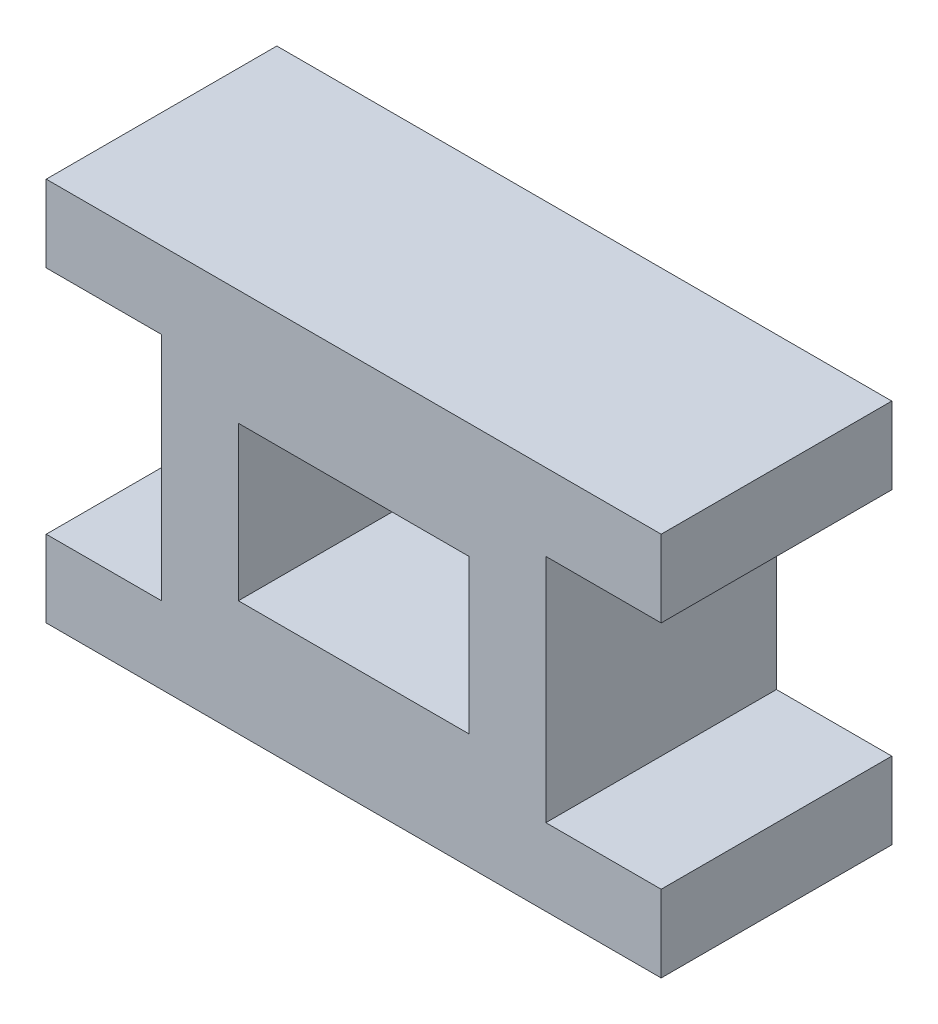
ISO-10303-21;
HEADER;
FILE_DESCRIPTION(('STEP AP214'),'2;1');
FILE_NAME('part.step','',(''),(''),'','','');
FILE_SCHEMA(('AUTOMOTIVE_DESIGN { 1 0 10303 214 1 1 1 1 }'));
ENDSEC;
DATA;
#1=APPLICATION_CONTEXT('core data for automotive mechanical design processes');
#2=APPLICATION_PROTOCOL_DEFINITION('international standard','automotive_design',2000,#1);
#3=PRODUCT_CONTEXT('',#1,'mechanical');
#4=PRODUCT('Part','Part','',(#3));
#5=PRODUCT_RELATED_PRODUCT_CATEGORY('part','',(#4));
#6=PRODUCT_DEFINITION_FORMATION('','',#4);
#7=PRODUCT_DEFINITION_CONTEXT('part definition',#1,'design');
#8=PRODUCT_DEFINITION('design','',#6,#7);
#9=PRODUCT_DEFINITION_SHAPE('','',#8);
#10=(LENGTH_UNIT() NAMED_UNIT(*) SI_UNIT(.MILLI.,.METRE.));
#11=(NAMED_UNIT(*) PLANE_ANGLE_UNIT() SI_UNIT($,.RADIAN.));
#12=(NAMED_UNIT(*) SI_UNIT($,.STERADIAN.) SOLID_ANGLE_UNIT());
#13=UNCERTAINTY_MEASURE_WITH_UNIT(LENGTH_MEASURE(1.E-05),#10,'distance_accuracy_value','');
#14=(GEOMETRIC_REPRESENTATION_CONTEXT(3) GLOBAL_UNCERTAINTY_ASSIGNED_CONTEXT((#13)) GLOBAL_UNIT_ASSIGNED_CONTEXT((#10,
#11,#12)) REPRESENTATION_CONTEXT('',''));
#15=CARTESIAN_POINT('',(0.,0.,0.));
#16=DIRECTION('',(0.,0.,1.));
#17=DIRECTION('',(1.,0.,0.));
#18=AXIS2_PLACEMENT_3D('',#15,#16,#17);
#19=CARTESIAN_POINT('',(0.,35.,30.));
#20=DIRECTION('',(0.,1.,0.));
#21=DIRECTION('',(0.,0.,1.));
#22=AXIS2_PLACEMENT_3D('',#19,#20,#21);
#23=PLANE('',#22);
#24=DIRECTION('',(1.,0.,0.));
#25=VECTOR('',#24,1.);
#26=CARTESIAN_POINT('',(0.,35.,0.));
#27=LINE('',#26,#25);
#28=CARTESIAN_POINT('',(-15.,35.,0.));
#29=VERTEX_POINT('',#28);
#30=CARTESIAN_POINT('',(15.,35.,0.));
#31=VERTEX_POINT('',#30);
#32=EDGE_CURVE('E216',#29,#31,#27,.T.);
#33=ORIENTED_EDGE('',*,*,#32,.T.);
#34=DIRECTION('',(0.,0.,-1.));
#35=VECTOR('',#34,1.);
#36=CARTESIAN_POINT('',(15.,35.,30.));
#37=LINE('',#36,#35);
#38=CARTESIAN_POINT('',(15.,35.,30.));
#39=VERTEX_POINT('',#38);
#40=EDGE_CURVE('E11',#39,#31,#37,.T.);
#41=ORIENTED_EDGE('',*,*,#40,.F.);
#42=DIRECTION('',(1.,0.,0.));
#43=VECTOR('',#42,1.);
#44=CARTESIAN_POINT('',(0.,35.,30.));
#45=LINE('',#44,#43);
#46=CARTESIAN_POINT('',(-15.,35.,30.));
#47=VERTEX_POINT('',#46);
#48=EDGE_CURVE('E165',#47,#39,#45,.T.);
#49=ORIENTED_EDGE('',*,*,#48,.F.);
#50=DIRECTION('',(0.,0.,-1.));
#51=VECTOR('',#50,1.);
#52=CARTESIAN_POINT('',(-15.,35.,30.));
#53=LINE('',#52,#51);
#54=EDGE_CURVE('E56',#47,#29,#53,.T.);
#55=ORIENTED_EDGE('',*,*,#54,.T.);
#56=EDGE_LOOP('',(#33,#41,#49,#55));
#57=FACE_BOUND('',#56,.T.);
#58=ADVANCED_FACE('F37',(#57),#23,.F.);
#59=CARTESIAN_POINT('',(15.,0.,30.));
#60=DIRECTION('',(1.,0.,0.));
#61=DIRECTION('',(0.,0.,-1.));
#62=AXIS2_PLACEMENT_3D('',#59,#60,#61);
#63=PLANE('',#62);
#64=DIRECTION('',(0.,-1.,0.));
#65=VECTOR('',#64,1.);
#66=CARTESIAN_POINT('',(15.,0.,0.));
#67=LINE('',#66,#65);
#68=CARTESIAN_POINT('',(15.,15.,0.));
#69=VERTEX_POINT('',#68);
#70=EDGE_CURVE('E171',#31,#69,#67,.T.);
#71=ORIENTED_EDGE('',*,*,#70,.T.);
#72=DIRECTION('',(0.,0.,-1.));
#73=VECTOR('',#72,1.);
#74=CARTESIAN_POINT('',(15.,15.,30.));
#75=LINE('',#74,#73);
#76=CARTESIAN_POINT('',(15.,15.,30.));
#77=VERTEX_POINT('',#76);
#78=EDGE_CURVE('E47',#77,#69,#75,.T.);
#79=ORIENTED_EDGE('',*,*,#78,.F.);
#80=DIRECTION('',(0.,-1.,0.));
#81=VECTOR('',#80,1.);
#82=CARTESIAN_POINT('',(15.,0.,30.));
#83=LINE('',#82,#81);
#84=EDGE_CURVE('E159',#39,#77,#83,.T.);
#85=ORIENTED_EDGE('',*,*,#84,.F.);
#86=ORIENTED_EDGE('',*,*,#40,.T.);
#87=EDGE_LOOP('',(#71,#79,#85,#86));
#88=FACE_BOUND('',#87,.T.);
#89=ADVANCED_FACE('F170',(#88),#63,.F.);
#90=CARTESIAN_POINT('',(0.,15.,30.));
#91=DIRECTION('',(0.,1.,0.));
#92=DIRECTION('',(0.,0.,1.));
#93=AXIS2_PLACEMENT_3D('',#90,#91,#92);
#94=PLANE('',#93);
#95=DIRECTION('',(1.,0.,0.));
#96=VECTOR('',#95,1.);
#97=CARTESIAN_POINT('',(0.,15.,0.));
#98=LINE('',#97,#96);
#99=CARTESIAN_POINT('',(-15.,15.,0.));
#100=VERTEX_POINT('',#99);
#101=EDGE_CURVE('E219',#100,#69,#98,.T.);
#102=ORIENTED_EDGE('',*,*,#101,.F.);
#103=DIRECTION('',(0.,0.,-1.));
#104=VECTOR('',#103,1.);
#105=CARTESIAN_POINT('',(-15.,15.,30.));
#106=LINE('',#105,#104);
#107=CARTESIAN_POINT('',(-15.,15.,30.));
#108=VERTEX_POINT('',#107);
#109=EDGE_CURVE('E106',#108,#100,#106,.T.);
#110=ORIENTED_EDGE('',*,*,#109,.F.);
#111=DIRECTION('',(1.,0.,0.));
#112=VECTOR('',#111,1.);
#113=CARTESIAN_POINT('',(0.,15.,30.));
#114=LINE('',#113,#112);
#115=EDGE_CURVE('E164',#108,#77,#114,.T.);
#116=ORIENTED_EDGE('',*,*,#115,.T.);
#117=ORIENTED_EDGE('',*,*,#78,.T.);
#118=EDGE_LOOP('',(#102,#110,#116,#117));
#119=FACE_BOUND('',#118,.T.);
#120=ADVANCED_FACE('F175',(#119),#94,.T.);
#121=CARTESIAN_POINT('',(0.,40.,30.));
#122=DIRECTION('',(0.,1.,0.));
#123=DIRECTION('',(0.,0.,1.));
#124=AXIS2_PLACEMENT_3D('',#121,#122,#123);
#125=PLANE('',#124);
#126=DIRECTION('',(1.,0.,0.));
#127=VECTOR('',#126,1.);
#128=CARTESIAN_POINT('',(0.,40.,0.));
#129=LINE('',#128,#127);
#130=CARTESIAN_POINT('',(-40.,40.,0.));
#131=VERTEX_POINT('',#130);
#132=CARTESIAN_POINT('',(-25.,40.,0.));
#133=VERTEX_POINT('',#132);
#134=EDGE_CURVE('E182',#131,#133,#129,.T.);
#135=ORIENTED_EDGE('',*,*,#134,.T.);
#136=DIRECTION('',(0.,0.,-1.));
#137=VECTOR('',#136,1.);
#138=CARTESIAN_POINT('',(-25.,40.,30.));
#139=LINE('',#138,#137);
#140=CARTESIAN_POINT('',(-25.,40.,30.));
#141=VERTEX_POINT('',#140);
#142=EDGE_CURVE('E41',#141,#133,#139,.T.);
#143=ORIENTED_EDGE('',*,*,#142,.F.);
#144=DIRECTION('',(1.,0.,0.));
#145=VECTOR('',#144,1.);
#146=CARTESIAN_POINT('',(0.,40.,30.));
#147=LINE('',#146,#145);
#148=CARTESIAN_POINT('',(-40.,40.,30.));
#149=VERTEX_POINT('',#148);
#150=EDGE_CURVE('E224',#149,#141,#147,.T.);
#151=ORIENTED_EDGE('',*,*,#150,.F.);
#152=DIRECTION('',(0.,0.,-1.));
#153=VECTOR('',#152,1.);
#154=CARTESIAN_POINT('',(-40.,40.,30.));
#155=LINE('',#154,#153);
#156=EDGE_CURVE('E178',#149,#131,#155,.T.);
#157=ORIENTED_EDGE('',*,*,#156,.T.);
#158=EDGE_LOOP('',(#135,#143,#151,#157));
#159=FACE_BOUND('',#158,.T.);
#160=ADVANCED_FACE('F39',(#159),#125,.F.);
#161=CARTESIAN_POINT('',(-25.,0.,30.));
#162=DIRECTION('',(1.,0.,0.));
#163=DIRECTION('',(0.,0.,-1.));
#164=AXIS2_PLACEMENT_3D('',#161,#162,#163);
#165=PLANE('',#164);
#166=DIRECTION('',(0.,-1.,0.));
#167=VECTOR('',#166,1.);
#168=CARTESIAN_POINT('',(-25.,0.,0.));
#169=LINE('',#168,#167);
#170=CARTESIAN_POINT('',(-25.,10.,0.));
#171=VERTEX_POINT('',#170);
#172=EDGE_CURVE('E185',#133,#171,#169,.T.);
#173=ORIENTED_EDGE('',*,*,#172,.T.);
#174=DIRECTION('',(0.,0.,-1.));
#175=VECTOR('',#174,1.);
#176=CARTESIAN_POINT('',(-25.,10.,30.));
#177=LINE('',#176,#175);
#178=CARTESIAN_POINT('',(-25.,10.,30.));
#179=VERTEX_POINT('',#178);
#180=EDGE_CURVE('E247',#179,#171,#177,.T.);
#181=ORIENTED_EDGE('',*,*,#180,.F.);
#182=DIRECTION('',(0.,-1.,0.));
#183=VECTOR('',#182,1.);
#184=CARTESIAN_POINT('',(-25.,0.,30.));
#185=LINE('',#184,#183);
#186=EDGE_CURVE('E119',#141,#179,#185,.T.);
#187=ORIENTED_EDGE('',*,*,#186,.F.);
#188=ORIENTED_EDGE('',*,*,#142,.T.);
#189=EDGE_LOOP('',(#173,#181,#187,#188));
#190=FACE_BOUND('',#189,.T.);
#191=ADVANCED_FACE('F252',(#190),#165,.F.);
#192=CARTESIAN_POINT('',(0.,9.99999999999999,30.));
#193=DIRECTION('',(0.,1.,0.));
#194=DIRECTION('',(-1.,0.,0.));
#195=AXIS2_PLACEMENT_3D('',#192,#193,#194);
#196=PLANE('',#195);
#197=DIRECTION('',(1.,0.,0.));
#198=VECTOR('',#197,1.);
#199=CARTESIAN_POINT('',(0.,9.99999999999999,0.));
#200=LINE('',#199,#198);
#201=CARTESIAN_POINT('',(-40.,10.,0.));
#202=VERTEX_POINT('',#201);
#203=EDGE_CURVE('E188',#202,#171,#200,.T.);
#204=ORIENTED_EDGE('',*,*,#203,.F.);
#205=DIRECTION('',(0.,0.,-1.));
#206=VECTOR('',#205,1.);
#207=CARTESIAN_POINT('',(-40.,10.,30.));
#208=LINE('',#207,#206);
#209=CARTESIAN_POINT('',(-40.,10.,30.));
#210=VERTEX_POINT('',#209);
#211=EDGE_CURVE('E246',#210,#202,#208,.T.);
#212=ORIENTED_EDGE('',*,*,#211,.F.);
#213=DIRECTION('',(1.,0.,0.));
#214=VECTOR('',#213,1.);
#215=CARTESIAN_POINT('',(0.,9.99999999999999,30.));
#216=LINE('',#215,#214);
#217=EDGE_CURVE('E267',#210,#179,#216,.T.);
#218=ORIENTED_EDGE('',*,*,#217,.T.);
#219=ORIENTED_EDGE('',*,*,#180,.T.);
#220=EDGE_LOOP('',(#204,#212,#218,#219));
#221=FACE_BOUND('',#220,.T.);
#222=ADVANCED_FACE('F264',(#221),#196,.T.);
#223=CARTESIAN_POINT('',(-40.,0.,30.));
#224=DIRECTION('',(1.,0.,0.));
#225=DIRECTION('',(0.,1.,0.));
#226=AXIS2_PLACEMENT_3D('',#223,#224,#225);
#227=PLANE('',#226);
#228=DIRECTION('',(0.,-1.,0.));
#229=VECTOR('',#228,1.);
#230=CARTESIAN_POINT('',(-40.,0.,0.));
#231=LINE('',#230,#229);
#232=CARTESIAN_POINT('',(-40.,0.,0.));
#233=VERTEX_POINT('',#232);
#234=EDGE_CURVE('E191',#202,#233,#231,.T.);
#235=ORIENTED_EDGE('',*,*,#234,.T.);
#236=DIRECTION('',(0.,0.,-1.));
#237=VECTOR('',#236,1.);
#238=CARTESIAN_POINT('',(-40.,0.,30.));
#239=LINE('',#238,#237);
#240=CARTESIAN_POINT('',(-40.,0.,30.));
#241=VERTEX_POINT('',#240);
#242=EDGE_CURVE('E243',#241,#233,#239,.T.);
#243=ORIENTED_EDGE('',*,*,#242,.F.);
#244=DIRECTION('',(0.,-1.,0.));
#245=VECTOR('',#244,1.);
#246=CARTESIAN_POINT('',(-40.,0.,30.));
#247=LINE('',#246,#245);
#248=EDGE_CURVE('E270',#210,#241,#247,.T.);
#249=ORIENTED_EDGE('',*,*,#248,.F.);
#250=ORIENTED_EDGE('',*,*,#211,.T.);
#251=EDGE_LOOP('',(#235,#243,#249,#250));
#252=FACE_BOUND('',#251,.T.);
#253=ADVANCED_FACE('F271',(#252),#227,.F.);
#254=CARTESIAN_POINT('',(0.,0.,30.));
#255=DIRECTION('',(0.,1.,0.));
#256=DIRECTION('',(0.,0.,1.));
#257=AXIS2_PLACEMENT_3D('',#254,#255,#256);
#258=PLANE('',#257);
#259=DIRECTION('',(1.,0.,0.));
#260=VECTOR('',#259,1.);
#261=CARTESIAN_POINT('',(0.,0.,0.));
#262=LINE('',#261,#260);
#263=CARTESIAN_POINT('',(40.,0.,0.));
#264=VERTEX_POINT('',#263);
#265=EDGE_CURVE('E193',#233,#264,#262,.T.);
#266=ORIENTED_EDGE('',*,*,#265,.T.);
#267=DIRECTION('',(0.,0.,-1.));
#268=VECTOR('',#267,1.);
#269=CARTESIAN_POINT('',(40.,0.,30.));
#270=LINE('',#269,#268);
#271=CARTESIAN_POINT('',(40.,0.,30.));
#272=VERTEX_POINT('',#271);
#273=EDGE_CURVE('E241',#272,#264,#270,.T.);
#274=ORIENTED_EDGE('',*,*,#273,.F.);
#275=DIRECTION('',(1.,0.,0.));
#276=VECTOR('',#275,1.);
#277=CARTESIAN_POINT('',(0.,0.,30.));
#278=LINE('',#277,#276);
#279=EDGE_CURVE('E274',#241,#272,#278,.T.);
#280=ORIENTED_EDGE('',*,*,#279,.F.);
#281=ORIENTED_EDGE('',*,*,#242,.T.);
#282=EDGE_LOOP('',(#266,#274,#280,#281));
#283=FACE_BOUND('',#282,.T.);
#284=ADVANCED_FACE('F327',(#283),#258,.F.);
#285=CARTESIAN_POINT('',(40.,0.,30.));
#286=DIRECTION('',(1.,0.,0.));
#287=DIRECTION('',(0.,1.,0.));
#288=AXIS2_PLACEMENT_3D('',#285,#286,#287);
#289=PLANE('',#288);
#290=DIRECTION('',(0.,-1.,0.));
#291=VECTOR('',#290,1.);
#292=CARTESIAN_POINT('',(40.,0.,0.));
#293=LINE('',#292,#291);
#294=CARTESIAN_POINT('',(40.,10.,0.));
#295=VERTEX_POINT('',#294);
#296=EDGE_CURVE('E196',#295,#264,#293,.T.);
#297=ORIENTED_EDGE('',*,*,#296,.F.);
#298=DIRECTION('',(0.,0.,-1.));
#299=VECTOR('',#298,1.);
#300=CARTESIAN_POINT('',(40.,10.,30.));
#301=LINE('',#300,#299);
#302=CARTESIAN_POINT('',(40.,10.,30.));
#303=VERTEX_POINT('',#302);
#304=EDGE_CURVE('E239',#303,#295,#301,.T.);
#305=ORIENTED_EDGE('',*,*,#304,.F.);
#306=DIRECTION('',(0.,-1.,0.));
#307=VECTOR('',#306,1.);
#308=CARTESIAN_POINT('',(40.,0.,30.));
#309=LINE('',#308,#307);
#310=EDGE_CURVE('E281',#303,#272,#309,.T.);
#311=ORIENTED_EDGE('',*,*,#310,.T.);
#312=ORIENTED_EDGE('',*,*,#273,.T.);
#313=EDGE_LOOP('',(#297,#305,#311,#312));
#314=FACE_BOUND('',#313,.T.);
#315=ADVANCED_FACE('F322',(#314),#289,.T.);
#316=CARTESIAN_POINT('',(0.,9.99999999999999,30.));
#317=DIRECTION('',(0.,-1.,0.));
#318=DIRECTION('',(1.,0.,0.));
#319=AXIS2_PLACEMENT_3D('',#316,#317,#318);
#320=PLANE('',#319);
#321=DIRECTION('',(-1.,0.,0.));
#322=VECTOR('',#321,1.);
#323=CARTESIAN_POINT('',(0.,9.99999999999999,0.));
#324=LINE('',#323,#322);
#325=CARTESIAN_POINT('',(25.,10.,0.));
#326=VERTEX_POINT('',#325);
#327=EDGE_CURVE('E199',#295,#326,#324,.T.);
#328=ORIENTED_EDGE('',*,*,#327,.T.);
#329=DIRECTION('',(0.,0.,-1.));
#330=VECTOR('',#329,1.);
#331=CARTESIAN_POINT('',(25.,10.,30.));
#332=LINE('',#331,#330);
#333=CARTESIAN_POINT('',(25.,10.,30.));
#334=VERTEX_POINT('',#333);
#335=EDGE_CURVE('E237',#334,#326,#332,.T.);
#336=ORIENTED_EDGE('',*,*,#335,.F.);
#337=DIRECTION('',(-1.,0.,0.));
#338=VECTOR('',#337,1.);
#339=CARTESIAN_POINT('',(0.,9.99999999999999,30.));
#340=LINE('',#339,#338);
#341=EDGE_CURVE('E284',#303,#334,#340,.T.);
#342=ORIENTED_EDGE('',*,*,#341,.F.);
#343=ORIENTED_EDGE('',*,*,#304,.T.);
#344=EDGE_LOOP('',(#328,#336,#342,#343));
#345=FACE_BOUND('',#344,.T.);
#346=ADVANCED_FACE('F328',(#345),#320,.F.);
#347=CARTESIAN_POINT('',(25.,0.,30.));
#348=DIRECTION('',(1.,0.,0.));
#349=DIRECTION('',(0.,0.,-1.));
#350=AXIS2_PLACEMENT_3D('',#347,#348,#349);
#351=PLANE('',#350);
#352=DIRECTION('',(0.,-1.,0.));
#353=VECTOR('',#352,1.);
#354=CARTESIAN_POINT('',(25.,0.,0.));
#355=LINE('',#354,#353);
#356=CARTESIAN_POINT('',(25.,40.,0.));
#357=VERTEX_POINT('',#356);
#358=EDGE_CURVE('E202',#357,#326,#355,.T.);
#359=ORIENTED_EDGE('',*,*,#358,.F.);
#360=DIRECTION('',(0.,0.,-1.));
#361=VECTOR('',#360,1.);
#362=CARTESIAN_POINT('',(25.,40.,30.));
#363=LINE('',#362,#361);
#364=CARTESIAN_POINT('',(25.,40.,30.));
#365=VERTEX_POINT('',#364);
#366=EDGE_CURVE('E235',#365,#357,#363,.T.);
#367=ORIENTED_EDGE('',*,*,#366,.F.);
#368=DIRECTION('',(0.,-1.,0.));
#369=VECTOR('',#368,1.);
#370=CARTESIAN_POINT('',(25.,0.,30.));
#371=LINE('',#370,#369);
#372=EDGE_CURVE('E286',#365,#334,#371,.T.);
#373=ORIENTED_EDGE('',*,*,#372,.T.);
#374=ORIENTED_EDGE('',*,*,#335,.T.);
#375=EDGE_LOOP('',(#359,#367,#373,#374));
#376=FACE_BOUND('',#375,.T.);
#377=ADVANCED_FACE('F316',(#376),#351,.T.);
#378=CARTESIAN_POINT('',(0.,40.,30.));
#379=DIRECTION('',(0.,-1.,0.));
#380=DIRECTION('',(0.,0.,-1.));
#381=AXIS2_PLACEMENT_3D('',#378,#379,#380);
#382=PLANE('',#381);
#383=DIRECTION('',(-1.,0.,0.));
#384=VECTOR('',#383,1.);
#385=CARTESIAN_POINT('',(0.,40.,0.));
#386=LINE('',#385,#384);
#387=CARTESIAN_POINT('',(40.,40.,0.));
#388=VERTEX_POINT('',#387);
#389=EDGE_CURVE('E205',#388,#357,#386,.T.);
#390=ORIENTED_EDGE('',*,*,#389,.F.);
#391=DIRECTION('',(0.,0.,-1.));
#392=VECTOR('',#391,1.);
#393=CARTESIAN_POINT('',(40.,40.,30.));
#394=LINE('',#393,#392);
#395=CARTESIAN_POINT('',(40.,40.,30.));
#396=VERTEX_POINT('',#395);
#397=EDGE_CURVE('E233',#396,#388,#394,.T.);
#398=ORIENTED_EDGE('',*,*,#397,.F.);
#399=DIRECTION('',(-1.,0.,0.));
#400=VECTOR('',#399,1.);
#401=CARTESIAN_POINT('',(0.,40.,30.));
#402=LINE('',#401,#400);
#403=EDGE_CURVE('E289',#396,#365,#402,.T.);
#404=ORIENTED_EDGE('',*,*,#403,.T.);
#405=ORIENTED_EDGE('',*,*,#366,.T.);
#406=EDGE_LOOP('',(#390,#398,#404,#405));
#407=FACE_BOUND('',#406,.T.);
#408=ADVANCED_FACE('F312',(#407),#382,.T.);
#409=CARTESIAN_POINT('',(40.,0.,30.));
#410=DIRECTION('',(1.,0.,0.));
#411=DIRECTION('',(0.,1.,0.));
#412=AXIS2_PLACEMENT_3D('',#409,#410,#411);
#413=PLANE('',#412);
#414=DIRECTION('',(0.,-1.,0.));
#415=VECTOR('',#414,1.);
#416=CARTESIAN_POINT('',(40.,0.,0.));
#417=LINE('',#416,#415);
#418=CARTESIAN_POINT('',(40.,50.,0.));
#419=VERTEX_POINT('',#418);
#420=EDGE_CURVE('E208',#419,#388,#417,.T.);
#421=ORIENTED_EDGE('',*,*,#420,.F.);
#422=DIRECTION('',(0.,0.,-1.));
#423=VECTOR('',#422,1.);
#424=CARTESIAN_POINT('',(40.,50.,30.));
#425=LINE('',#424,#423);
#426=CARTESIAN_POINT('',(40.,50.,30.));
#427=VERTEX_POINT('',#426);
#428=EDGE_CURVE('E231',#427,#419,#425,.T.);
#429=ORIENTED_EDGE('',*,*,#428,.F.);
#430=DIRECTION('',(0.,-1.,0.));
#431=VECTOR('',#430,1.);
#432=CARTESIAN_POINT('',(40.,0.,30.));
#433=LINE('',#432,#431);
#434=EDGE_CURVE('E292',#427,#396,#433,.T.);
#435=ORIENTED_EDGE('',*,*,#434,.T.);
#436=ORIENTED_EDGE('',*,*,#397,.T.);
#437=EDGE_LOOP('',(#421,#429,#435,#436));
#438=FACE_BOUND('',#437,.T.);
#439=ADVANCED_FACE('F309',(#438),#413,.T.);
#440=CARTESIAN_POINT('',(0.,50.,30.));
#441=DIRECTION('',(0.,1.,0.));
#442=DIRECTION('',(0.,0.,1.));
#443=AXIS2_PLACEMENT_3D('',#440,#441,#442);
#444=PLANE('',#443);
#445=DIRECTION('',(1.,0.,0.));
#446=VECTOR('',#445,1.);
#447=CARTESIAN_POINT('',(0.,50.,0.));
#448=LINE('',#447,#446);
#449=CARTESIAN_POINT('',(-40.,50.,0.));
#450=VERTEX_POINT('',#449);
#451=EDGE_CURVE('E211',#450,#419,#448,.T.);
#452=ORIENTED_EDGE('',*,*,#451,.F.);
#453=DIRECTION('',(0.,0.,-1.));
#454=VECTOR('',#453,1.);
#455=CARTESIAN_POINT('',(-40.,50.,30.));
#456=LINE('',#455,#454);
#457=CARTESIAN_POINT('',(-40.,50.,30.));
#458=VERTEX_POINT('',#457);
#459=EDGE_CURVE('E229',#458,#450,#456,.T.);
#460=ORIENTED_EDGE('',*,*,#459,.F.);
#461=DIRECTION('',(1.,0.,0.));
#462=VECTOR('',#461,1.);
#463=CARTESIAN_POINT('',(0.,50.,30.));
#464=LINE('',#463,#462);
#465=EDGE_CURVE('E295',#458,#427,#464,.T.);
#466=ORIENTED_EDGE('',*,*,#465,.T.);
#467=ORIENTED_EDGE('',*,*,#428,.T.);
#468=EDGE_LOOP('',(#452,#460,#466,#467));
#469=FACE_BOUND('',#468,.T.);
#470=ADVANCED_FACE('F305',(#469),#444,.T.);
#471=CARTESIAN_POINT('',(-39.9999999999999,-1.38777878078144E-13,30.));
#472=DIRECTION('',(1.,0.,0.));
#473=DIRECTION('',(0.,1.,0.));
#474=AXIS2_PLACEMENT_3D('',#471,#472,#473);
#475=PLANE('',#474);
#476=DIRECTION('',(0.,-1.,0.));
#477=VECTOR('',#476,1.);
#478=CARTESIAN_POINT('',(-39.9999999999999,-1.38777878078144E-13,0.));
#479=LINE('',#478,#477);
#480=EDGE_CURVE('E214',#450,#131,#479,.T.);
#481=ORIENTED_EDGE('',*,*,#480,.T.);
#482=ORIENTED_EDGE('',*,*,#156,.F.);
#483=DIRECTION('',(0.,-1.,0.));
#484=VECTOR('',#483,1.);
#485=CARTESIAN_POINT('',(-39.9999999999999,-1.38777878078144E-13,30.));
#486=LINE('',#485,#484);
#487=EDGE_CURVE('E298',#458,#149,#486,.T.);
#488=ORIENTED_EDGE('',*,*,#487,.F.);
#489=ORIENTED_EDGE('',*,*,#459,.T.);
#490=EDGE_LOOP('',(#481,#482,#488,#489));
#491=FACE_BOUND('',#490,.T.);
#492=ADVANCED_FACE('F303',(#491),#475,.F.);
#493=CARTESIAN_POINT('',(-15.,0.,30.));
#494=DIRECTION('',(1.,0.,0.));
#495=DIRECTION('',(0.,0.,-1.));
#496=AXIS2_PLACEMENT_3D('',#493,#494,#495);
#497=PLANE('',#496);
#498=DIRECTION('',(0.,-1.,0.));
#499=VECTOR('',#498,1.);
#500=CARTESIAN_POINT('',(-15.,0.,0.));
#501=LINE('',#500,#499);
#502=EDGE_CURVE('E221',#29,#100,#501,.T.);
#503=ORIENTED_EDGE('',*,*,#502,.F.);
#504=ORIENTED_EDGE('',*,*,#54,.F.);
#505=DIRECTION('',(0.,-1.,0.));
#506=VECTOR('',#505,1.);
#507=CARTESIAN_POINT('',(-15.,0.,30.));
#508=LINE('',#507,#506);
#509=EDGE_CURVE('E176',#47,#108,#508,.T.);
#510=ORIENTED_EDGE('',*,*,#509,.T.);
#511=ORIENTED_EDGE('',*,*,#109,.T.);
#512=EDGE_LOOP('',(#503,#504,#510,#511));
#513=FACE_BOUND('',#512,.T.);
#514=ADVANCED_FACE('F347',(#513),#497,.T.);
#515=CARTESIAN_POINT('',(0.,0.,30.));
#516=DIRECTION('',(0.,0.,1.));
#517=DIRECTION('',(1.,0.,0.));
#518=AXIS2_PLACEMENT_3D('',#515,#516,#517);
#519=PLANE('',#518);
#520=ORIENTED_EDGE('',*,*,#150,.T.);
#521=ORIENTED_EDGE('',*,*,#186,.T.);
#522=ORIENTED_EDGE('',*,*,#217,.F.);
#523=ORIENTED_EDGE('',*,*,#248,.T.);
#524=ORIENTED_EDGE('',*,*,#279,.T.);
#525=ORIENTED_EDGE('',*,*,#310,.F.);
#526=ORIENTED_EDGE('',*,*,#341,.T.);
#527=ORIENTED_EDGE('',*,*,#372,.F.);
#528=ORIENTED_EDGE('',*,*,#403,.F.);
#529=ORIENTED_EDGE('',*,*,#434,.F.);
#530=ORIENTED_EDGE('',*,*,#465,.F.);
#531=ORIENTED_EDGE('',*,*,#487,.T.);
#532=EDGE_LOOP('',(#520,#521,#522,#523,#524,#525,#526,#527,#528,#529,#530,#531));
#533=FACE_BOUND('',#532,.T.);
#534=ORIENTED_EDGE('',*,*,#48,.T.);
#535=ORIENTED_EDGE('',*,*,#84,.T.);
#536=ORIENTED_EDGE('',*,*,#115,.F.);
#537=ORIENTED_EDGE('',*,*,#509,.F.);
#538=EDGE_LOOP('',(#534,#535,#536,#537));
#539=FACE_BOUND('',#538,.T.);
#540=ADVANCED_FACE('F161',(#533,#539),#519,.T.);
#541=CARTESIAN_POINT('',(0.,0.,0.));
#542=DIRECTION('',(0.,0.,1.));
#543=DIRECTION('',(1.,0.,0.));
#544=AXIS2_PLACEMENT_3D('',#541,#542,#543);
#545=PLANE('',#544);
#546=ORIENTED_EDGE('',*,*,#134,.F.);
#547=ORIENTED_EDGE('',*,*,#480,.F.);
#548=ORIENTED_EDGE('',*,*,#451,.T.);
#549=ORIENTED_EDGE('',*,*,#420,.T.);
#550=ORIENTED_EDGE('',*,*,#389,.T.);
#551=ORIENTED_EDGE('',*,*,#358,.T.);
#552=ORIENTED_EDGE('',*,*,#327,.F.);
#553=ORIENTED_EDGE('',*,*,#296,.T.);
#554=ORIENTED_EDGE('',*,*,#265,.F.);
#555=ORIENTED_EDGE('',*,*,#234,.F.);
#556=ORIENTED_EDGE('',*,*,#203,.T.);
#557=ORIENTED_EDGE('',*,*,#172,.F.);
#558=EDGE_LOOP('',(#546,#547,#548,#549,#550,#551,#552,#553,#554,#555,#556,#557));
#559=FACE_BOUND('',#558,.T.);
#560=ORIENTED_EDGE('',*,*,#32,.F.);
#561=ORIENTED_EDGE('',*,*,#502,.T.);
#562=ORIENTED_EDGE('',*,*,#101,.T.);
#563=ORIENTED_EDGE('',*,*,#70,.F.);
#564=EDGE_LOOP('',(#560,#561,#562,#563));
#565=FACE_BOUND('',#564,.T.);
#566=ADVANCED_FACE('F259',(#559,#565),#545,.F.);
#567=CLOSED_SHELL('',(#58,#89,#120,#160,#191,#222,#253,#284,#315,#346,#377,#408,#439,#470,#492,
#514,#540,#566));
#568=MANIFOLD_SOLID_BREP('B2',#567);
#569=ADVANCED_BREP_SHAPE_REPRESENTATION('',(#18,#568),#14);
#570=SHAPE_DEFINITION_REPRESENTATION(#9,#569);
ENDSEC;
END-ISO-10303-21;
